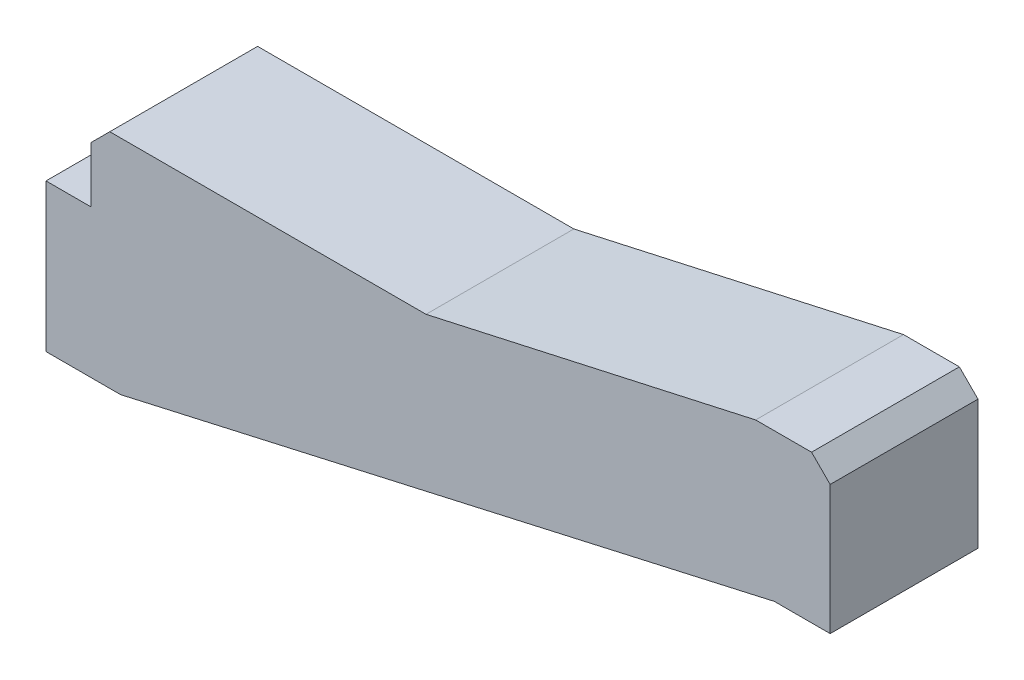
ISO-10303-21;
HEADER;
FILE_DESCRIPTION(('STEP AP214'),'2;1');
FILE_NAME('part.step','',(''),(''),'','','');
FILE_SCHEMA(('AUTOMOTIVE_DESIGN { 1 0 10303 214 1 1 1 1 }'));
ENDSEC;
DATA;
#1=APPLICATION_CONTEXT('core data for automotive mechanical design processes');
#2=APPLICATION_PROTOCOL_DEFINITION('international standard','automotive_design',2000,#1);
#3=PRODUCT_CONTEXT('',#1,'mechanical');
#4=PRODUCT('Part','Part','',(#3));
#5=PRODUCT_RELATED_PRODUCT_CATEGORY('part','',(#4));
#6=PRODUCT_DEFINITION_FORMATION('','',#4);
#7=PRODUCT_DEFINITION_CONTEXT('part definition',#1,'design');
#8=PRODUCT_DEFINITION('design','',#6,#7);
#9=PRODUCT_DEFINITION_SHAPE('','',#8);
#10=(LENGTH_UNIT() NAMED_UNIT(*) SI_UNIT(.MILLI.,.METRE.));
#11=(NAMED_UNIT(*) PLANE_ANGLE_UNIT() SI_UNIT($,.RADIAN.));
#12=(NAMED_UNIT(*) SI_UNIT($,.STERADIAN.) SOLID_ANGLE_UNIT());
#13=UNCERTAINTY_MEASURE_WITH_UNIT(LENGTH_MEASURE(1.E-05),#10,'distance_accuracy_value','');
#14=(GEOMETRIC_REPRESENTATION_CONTEXT(3) GLOBAL_UNCERTAINTY_ASSIGNED_CONTEXT((#13)) GLOBAL_UNIT_ASSIGNED_CONTEXT((#10,
#11,#12)) REPRESENTATION_CONTEXT('',''));
#15=CARTESIAN_POINT('',(0.,0.,0.));
#16=DIRECTION('',(0.,0.,1.));
#17=DIRECTION('',(1.,0.,0.));
#18=AXIS2_PLACEMENT_3D('',#15,#16,#17);
#19=CARTESIAN_POINT('',(-4.42488188976378,-0.984375000000001,1.984375));
#20=DIRECTION('',(0.217154949463908,-0.976137146062646,0.));
#21=DIRECTION('',(0.976137146062646,0.217154949463909,0.));
#22=AXIS2_PLACEMENT_3D('',#19,#20,#21);
#23=PLANE('',#22);
#24=DIRECTION('',(-0.976137146062646,-0.217154949463908,0.));
#25=VECTOR('',#24,1.);
#26=CARTESIAN_POINT('',(-4.42488188976378,-0.984375000000001,0.));
#27=LINE('',#26,#25);
#28=CARTESIAN_POINT('',(0.,0.,0.));
#29=VERTEX_POINT('',#28);
#30=CARTESIAN_POINT('',(-4.42488188976378,-0.984375000000001,0.));
#31=VERTEX_POINT('',#30);
#32=EDGE_CURVE('E137',#29,#31,#27,.T.);
#33=ORIENTED_EDGE('',*,*,#32,.T.);
#34=DIRECTION('',(0.,0.,-1.));
#35=VECTOR('',#34,1.);
#36=CARTESIAN_POINT('',(-4.42488188976378,-0.984375000000001,1.984375));
#37=LINE('',#36,#35);
#38=CARTESIAN_POINT('',(-4.42488188976378,-0.984375000000001,1.984375));
#39=VERTEX_POINT('',#38);
#40=EDGE_CURVE('E121',#39,#31,#37,.T.);
#41=ORIENTED_EDGE('',*,*,#40,.F.);
#42=DIRECTION('',(-0.976137146062646,-0.217154949463908,0.));
#43=VECTOR('',#42,1.);
#44=CARTESIAN_POINT('',(-4.42488188976378,-0.984375000000001,1.984375));
#45=LINE('',#44,#43);
#46=CARTESIAN_POINT('',(0.,0.,1.984375));
#47=VERTEX_POINT('',#46);
#48=EDGE_CURVE('E124',#47,#39,#45,.T.);
#49=ORIENTED_EDGE('',*,*,#48,.F.);
#50=DIRECTION('',(0.,0.,-1.));
#51=VECTOR('',#50,1.);
#52=CARTESIAN_POINT('',(0.,0.,1.984375));
#53=LINE('',#52,#51);
#54=EDGE_CURVE('E188',#47,#29,#53,.T.);
#55=ORIENTED_EDGE('',*,*,#54,.T.);
#56=EDGE_LOOP('',(#33,#41,#49,#55));
#57=FACE_BOUND('',#56,.T.);
#58=ADVANCED_FACE('F31',(#57),#23,.F.);
#59=CARTESIAN_POINT('',(-8.92,-0.984375000000001,1.984375));
#60=DIRECTION('',(0.,-1.,0.));
#61=DIRECTION('',(1.,0.,0.));
#62=AXIS2_PLACEMENT_3D('',#59,#60,#61);
#63=PLANE('',#62);
#64=DIRECTION('',(-1.,0.,0.));
#65=VECTOR('',#64,1.);
#66=CARTESIAN_POINT('',(-8.92,-0.984375000000001,0.));
#67=LINE('',#66,#65);
#68=CARTESIAN_POINT('',(-8.67,-0.984375000000001,0.));
#69=VERTEX_POINT('',#68);
#70=EDGE_CURVE('E170',#31,#69,#67,.T.);
#71=ORIENTED_EDGE('',*,*,#70,.T.);
#72=DIRECTION('',(0.,0.,1.));
#73=VECTOR('',#72,1.);
#74=CARTESIAN_POINT('',(-8.67,-0.984375000000001,1.984375));
#75=LINE('',#74,#73);
#76=CARTESIAN_POINT('',(-8.67,-0.984375000000001,1.984375));
#77=VERTEX_POINT('',#76);
#78=EDGE_CURVE('E11',#69,#77,#75,.T.);
#79=ORIENTED_EDGE('',*,*,#78,.T.);
#80=DIRECTION('',(-1.,0.,0.));
#81=VECTOR('',#80,1.);
#82=CARTESIAN_POINT('',(-8.92,-0.984375000000001,1.984375));
#83=LINE('',#82,#81);
#84=EDGE_CURVE('E117',#39,#77,#83,.T.);
#85=ORIENTED_EDGE('',*,*,#84,.F.);
#86=ORIENTED_EDGE('',*,*,#40,.T.);
#87=EDGE_LOOP('',(#71,#79,#85,#86));
#88=FACE_BOUND('',#87,.T.);
#89=ADVANCED_FACE('F119',(#88),#63,.F.);
#90=CARTESIAN_POINT('',(-8.92,-1.984375,1.984375));
#91=DIRECTION('',(1.,0.,0.));
#92=DIRECTION('',(0.,0.,-1.));
#93=AXIS2_PLACEMENT_3D('',#90,#91,#92);
#94=PLANE('',#93);
#95=DIRECTION('',(0.,-1.,0.));
#96=VECTOR('',#95,1.);
#97=CARTESIAN_POINT('',(-8.92,-1.984375,1.984375));
#98=LINE('',#97,#96);
#99=CARTESIAN_POINT('',(-8.92,-1.234375,1.984375));
#100=VERTEX_POINT('',#99);
#101=CARTESIAN_POINT('',(-8.92,-1.984375,1.984375));
#102=VERTEX_POINT('',#101);
#103=EDGE_CURVE('E123',#100,#102,#98,.T.);
#104=ORIENTED_EDGE('',*,*,#103,.F.);
#105=DIRECTION('',(0.,0.,-1.));
#106=VECTOR('',#105,1.);
#107=CARTESIAN_POINT('',(-8.92,-1.234375,1.984375));
#108=LINE('',#107,#106);
#109=CARTESIAN_POINT('',(-8.92,-1.234375,0.));
#110=VERTEX_POINT('',#109);
#111=EDGE_CURVE('E39',#100,#110,#108,.T.);
#112=ORIENTED_EDGE('',*,*,#111,.T.);
#113=DIRECTION('',(0.,-1.,0.));
#114=VECTOR('',#113,1.);
#115=CARTESIAN_POINT('',(-8.92,-1.984375,0.));
#116=LINE('',#115,#114);
#117=CARTESIAN_POINT('',(-8.92,-1.984375,0.));
#118=VERTEX_POINT('',#117);
#119=EDGE_CURVE('E162',#110,#118,#116,.T.);
#120=ORIENTED_EDGE('',*,*,#119,.T.);
#121=DIRECTION('',(0.,0.,-1.));
#122=VECTOR('',#121,1.);
#123=CARTESIAN_POINT('',(-8.92,-1.984375,1.984375));
#124=LINE('',#123,#122);
#125=EDGE_CURVE('E139',#102,#118,#124,.T.);
#126=ORIENTED_EDGE('',*,*,#125,.F.);
#127=EDGE_LOOP('',(#104,#112,#120,#126));
#128=FACE_BOUND('',#127,.T.);
#129=ADVANCED_FACE('F160',(#128),#94,.F.);
#130=CARTESIAN_POINT('',(-9.52612547489135,-1.984375,1.984375));
#131=DIRECTION('',(0.,-1.,0.));
#132=DIRECTION('',(0.,0.,-1.));
#133=AXIS2_PLACEMENT_3D('',#130,#131,#132);
#134=PLANE('',#133);
#135=DIRECTION('',(-1.,0.,0.));
#136=VECTOR('',#135,1.);
#137=CARTESIAN_POINT('',(-9.52612547489135,-1.984375,0.));
#138=LINE('',#137,#136);
#139=CARTESIAN_POINT('',(-9.52612547489135,-1.984375,0.));
#140=VERTEX_POINT('',#139);
#141=EDGE_CURVE('E169',#118,#140,#138,.T.);
#142=ORIENTED_EDGE('',*,*,#141,.T.);
#143=DIRECTION('',(0.,0.,-1.));
#144=VECTOR('',#143,1.);
#145=CARTESIAN_POINT('',(-9.52612547489135,-1.984375,1.984375));
#146=LINE('',#145,#144);
#147=CARTESIAN_POINT('',(-9.52612547489135,-1.984375,1.984375));
#148=VERTEX_POINT('',#147);
#149=EDGE_CURVE('E145',#148,#140,#146,.T.);
#150=ORIENTED_EDGE('',*,*,#149,.F.);
#151=DIRECTION('',(-1.,0.,0.));
#152=VECTOR('',#151,1.);
#153=CARTESIAN_POINT('',(-9.52612547489135,-1.984375,1.984375));
#154=LINE('',#153,#152);
#155=EDGE_CURVE('E357',#102,#148,#154,.T.);
#156=ORIENTED_EDGE('',*,*,#155,.F.);
#157=ORIENTED_EDGE('',*,*,#125,.T.);
#158=EDGE_LOOP('',(#142,#150,#156,#157));
#159=FACE_BOUND('',#158,.T.);
#160=ADVANCED_FACE('F257',(#159),#134,.F.);
#161=CARTESIAN_POINT('',(-9.52612547489135,-3.96875,1.984375));
#162=DIRECTION('',(1.,0.,0.));
#163=DIRECTION('',(0.,1.,0.));
#164=AXIS2_PLACEMENT_3D('',#161,#162,#163);
#165=PLANE('',#164);
#166=DIRECTION('',(0.,-1.,0.));
#167=VECTOR('',#166,1.);
#168=CARTESIAN_POINT('',(-9.52612547489135,-3.96875,0.));
#169=LINE('',#168,#167);
#170=CARTESIAN_POINT('',(-9.52612547489135,-3.96875,0.));
#171=VERTEX_POINT('',#170);
#172=EDGE_CURVE('E172',#140,#171,#169,.T.);
#173=ORIENTED_EDGE('',*,*,#172,.T.);
#174=DIRECTION('',(0.,0.,-1.));
#175=VECTOR('',#174,1.);
#176=CARTESIAN_POINT('',(-9.52612547489135,-3.96875,1.984375));
#177=LINE('',#176,#175);
#178=CARTESIAN_POINT('',(-9.52612547489135,-3.96875,1.984375));
#179=VERTEX_POINT('',#178);
#180=EDGE_CURVE('E199',#179,#171,#177,.T.);
#181=ORIENTED_EDGE('',*,*,#180,.F.);
#182=DIRECTION('',(0.,-1.,0.));
#183=VECTOR('',#182,1.);
#184=CARTESIAN_POINT('',(-9.52612547489135,-3.96875,1.984375));
#185=LINE('',#184,#183);
#186=EDGE_CURVE('E207',#148,#179,#185,.T.);
#187=ORIENTED_EDGE('',*,*,#186,.F.);
#188=ORIENTED_EDGE('',*,*,#149,.T.);
#189=EDGE_LOOP('',(#173,#181,#187,#188));
#190=FACE_BOUND('',#189,.T.);
#191=ADVANCED_FACE('F205',(#190),#165,.F.);
#192=CARTESIAN_POINT('',(-8.52612547489135,-3.96875,1.984375));
#193=DIRECTION('',(0.,1.,0.));
#194=DIRECTION('',(0.,0.,1.));
#195=AXIS2_PLACEMENT_3D('',#192,#193,#194);
#196=PLANE('',#195);
#197=DIRECTION('',(1.,0.,0.));
#198=VECTOR('',#197,1.);
#199=CARTESIAN_POINT('',(-8.52612547489135,-3.96875,0.));
#200=LINE('',#199,#198);
#201=CARTESIAN_POINT('',(-8.52612547489135,-3.96875,0.));
#202=VERTEX_POINT('',#201);
#203=EDGE_CURVE('E178',#171,#202,#200,.T.);
#204=ORIENTED_EDGE('',*,*,#203,.T.);
#205=DIRECTION('',(0.,0.,-1.));
#206=VECTOR('',#205,1.);
#207=CARTESIAN_POINT('',(-8.52612547489135,-3.96875,1.984375));
#208=LINE('',#207,#206);
#209=CARTESIAN_POINT('',(-8.52612547489135,-3.96875,1.984375));
#210=VERTEX_POINT('',#209);
#211=EDGE_CURVE('E196',#210,#202,#208,.T.);
#212=ORIENTED_EDGE('',*,*,#211,.F.);
#213=DIRECTION('',(1.,0.,0.));
#214=VECTOR('',#213,1.);
#215=CARTESIAN_POINT('',(-8.52612547489135,-3.96875,1.984375));
#216=LINE('',#215,#214);
#217=EDGE_CURVE('E224',#179,#210,#216,.T.);
#218=ORIENTED_EDGE('',*,*,#217,.F.);
#219=ORIENTED_EDGE('',*,*,#180,.T.);
#220=EDGE_LOOP('',(#204,#212,#218,#219));
#221=FACE_BOUND('',#220,.T.);
#222=ADVANCED_FACE('F215',(#221),#196,.F.);
#223=CARTESIAN_POINT('',(0.25,-1.984375,1.984375));
#224=DIRECTION('',(-0.220543129572824,0.975377223436258,0.));
#225=DIRECTION('',(-0.975377223436258,-0.220543129572824,0.));
#226=AXIS2_PLACEMENT_3D('',#223,#224,#225);
#227=PLANE('',#226);
#228=DIRECTION('',(0.975377223436258,0.220543129572824,0.));
#229=VECTOR('',#228,1.);
#230=CARTESIAN_POINT('',(0.25,-1.984375,0.));
#231=LINE('',#230,#229);
#232=CARTESIAN_POINT('',(0.25,-1.984375,0.));
#233=VERTEX_POINT('',#232);
#234=EDGE_CURVE('E180',#202,#233,#231,.T.);
#235=ORIENTED_EDGE('',*,*,#234,.T.);
#236=DIRECTION('',(0.,0.,-1.));
#237=VECTOR('',#236,1.);
#238=CARTESIAN_POINT('',(0.25,-1.984375,1.984375));
#239=LINE('',#238,#237);
#240=CARTESIAN_POINT('',(0.25,-1.984375,1.984375));
#241=VERTEX_POINT('',#240);
#242=EDGE_CURVE('E193',#241,#233,#239,.T.);
#243=ORIENTED_EDGE('',*,*,#242,.F.);
#244=DIRECTION('',(0.975377223436258,0.220543129572824,0.));
#245=VECTOR('',#244,1.);
#246=CARTESIAN_POINT('',(0.25,-1.984375,1.984375));
#247=LINE('',#246,#245);
#248=EDGE_CURVE('E221',#210,#241,#247,.T.);
#249=ORIENTED_EDGE('',*,*,#248,.F.);
#250=ORIENTED_EDGE('',*,*,#211,.T.);
#251=EDGE_LOOP('',(#235,#243,#249,#250));
#252=FACE_BOUND('',#251,.T.);
#253=ADVANCED_FACE('F219',(#252),#227,.F.);
#254=CARTESIAN_POINT('',(1.,-1.984375,1.984375));
#255=DIRECTION('',(0.,1.,0.));
#256=DIRECTION('',(0.,0.,1.));
#257=AXIS2_PLACEMENT_3D('',#254,#255,#256);
#258=PLANE('',#257);
#259=DIRECTION('',(1.,0.,0.));
#260=VECTOR('',#259,1.);
#261=CARTESIAN_POINT('',(1.,-1.984375,0.));
#262=LINE('',#261,#260);
#263=CARTESIAN_POINT('',(1.,-1.984375,0.));
#264=VERTEX_POINT('',#263);
#265=EDGE_CURVE('E182',#233,#264,#262,.T.);
#266=ORIENTED_EDGE('',*,*,#265,.T.);
#267=DIRECTION('',(0.,0.,-1.));
#268=VECTOR('',#267,1.);
#269=CARTESIAN_POINT('',(1.,-1.984375,1.984375));
#270=LINE('',#269,#268);
#271=CARTESIAN_POINT('',(1.,-1.984375,1.984375));
#272=VERTEX_POINT('',#271);
#273=EDGE_CURVE('E190',#272,#264,#270,.T.);
#274=ORIENTED_EDGE('',*,*,#273,.F.);
#275=DIRECTION('',(1.,0.,0.));
#276=VECTOR('',#275,1.);
#277=CARTESIAN_POINT('',(1.,-1.984375,1.984375));
#278=LINE('',#277,#276);
#279=EDGE_CURVE('E223',#241,#272,#278,.T.);
#280=ORIENTED_EDGE('',*,*,#279,.F.);
#281=ORIENTED_EDGE('',*,*,#242,.T.);
#282=EDGE_LOOP('',(#266,#274,#280,#281));
#283=FACE_BOUND('',#282,.T.);
#284=ADVANCED_FACE('F266',(#283),#258,.F.);
#285=CARTESIAN_POINT('',(1.,0.,1.984375));
#286=DIRECTION('',(-1.,0.,0.));
#287=DIRECTION('',(0.,-1.,0.));
#288=AXIS2_PLACEMENT_3D('',#285,#286,#287);
#289=PLANE('',#288);
#290=DIRECTION('',(0.,1.,0.));
#291=VECTOR('',#290,1.);
#292=CARTESIAN_POINT('',(1.,0.,0.));
#293=LINE('',#292,#291);
#294=CARTESIAN_POINT('',(1.,-0.25,0.));
#295=VERTEX_POINT('',#294);
#296=EDGE_CURVE('E184',#264,#295,#293,.T.);
#297=ORIENTED_EDGE('',*,*,#296,.T.);
#298=DIRECTION('',(0.,0.,1.));
#299=VECTOR('',#298,1.);
#300=CARTESIAN_POINT('',(1.,-0.25,1.984375));
#301=LINE('',#300,#299);
#302=CARTESIAN_POINT('',(1.,-0.25,1.984375));
#303=VERTEX_POINT('',#302);
#304=EDGE_CURVE('E152',#295,#303,#301,.T.);
#305=ORIENTED_EDGE('',*,*,#304,.T.);
#306=DIRECTION('',(0.,1.,0.));
#307=VECTOR('',#306,1.);
#308=CARTESIAN_POINT('',(1.,0.,1.984375));
#309=LINE('',#308,#307);
#310=EDGE_CURVE('E226',#272,#303,#309,.T.);
#311=ORIENTED_EDGE('',*,*,#310,.F.);
#312=ORIENTED_EDGE('',*,*,#273,.T.);
#313=EDGE_LOOP('',(#297,#305,#311,#312));
#314=FACE_BOUND('',#313,.T.);
#315=ADVANCED_FACE('F269',(#314),#289,.F.);
#316=CARTESIAN_POINT('',(0.,0.,1.984375));
#317=DIRECTION('',(0.,-1.,0.));
#318=DIRECTION('',(0.,0.,-1.));
#319=AXIS2_PLACEMENT_3D('',#316,#317,#318);
#320=PLANE('',#319);
#321=DIRECTION('',(-1.,0.,0.));
#322=VECTOR('',#321,1.);
#323=CARTESIAN_POINT('',(0.,0.,1.984375));
#324=LINE('',#323,#322);
#325=CARTESIAN_POINT('',(0.75,0.,1.984375));
#326=VERTEX_POINT('',#325);
#327=EDGE_CURVE('E130',#326,#47,#324,.T.);
#328=ORIENTED_EDGE('',*,*,#327,.F.);
#329=DIRECTION('',(0.,0.,-1.));
#330=VECTOR('',#329,1.);
#331=CARTESIAN_POINT('',(0.75,0.,1.984375));
#332=LINE('',#331,#330);
#333=CARTESIAN_POINT('',(0.75,0.,0.));
#334=VERTEX_POINT('',#333);
#335=EDGE_CURVE('E138',#326,#334,#332,.T.);
#336=ORIENTED_EDGE('',*,*,#335,.T.);
#337=DIRECTION('',(-1.,0.,0.));
#338=VECTOR('',#337,1.);
#339=CARTESIAN_POINT('',(0.,0.,0.));
#340=LINE('',#339,#338);
#341=EDGE_CURVE('E134',#334,#29,#340,.T.);
#342=ORIENTED_EDGE('',*,*,#341,.T.);
#343=ORIENTED_EDGE('',*,*,#54,.F.);
#344=EDGE_LOOP('',(#328,#336,#342,#343));
#345=FACE_BOUND('',#344,.T.);
#346=ADVANCED_FACE('F241',(#345),#320,.F.);
#347=CARTESIAN_POINT('',(1.,0.222463565022422,1.984375));
#348=DIRECTION('',(0.,0.,-1.));
#349=DIRECTION('',(-1.,0.,0.));
#350=AXIS2_PLACEMENT_3D('',#347,#348,#349);
#351=PLANE('',#350);
#352=ORIENTED_EDGE('',*,*,#310,.T.);
#353=DIRECTION('',(0.707106781186548,-0.707106781186548,0.));
#354=VECTOR('',#353,1.);
#355=CARTESIAN_POINT('',(0.75,0.,1.984375));
#356=LINE('',#355,#354);
#357=EDGE_CURVE('E155',#303,#326,#356,.F.);
#358=ORIENTED_EDGE('',*,*,#357,.T.);
#359=ORIENTED_EDGE('',*,*,#327,.T.);
#360=ORIENTED_EDGE('',*,*,#48,.T.);
#361=ORIENTED_EDGE('',*,*,#84,.T.);
#362=DIRECTION('',(0.707106781186545,0.70710678118655,0.));
#363=VECTOR('',#362,1.);
#364=CARTESIAN_POINT('',(-8.92,-1.234375,1.984375));
#365=LINE('',#364,#363);
#366=EDGE_CURVE('E46',#77,#100,#365,.F.);
#367=ORIENTED_EDGE('',*,*,#366,.T.);
#368=ORIENTED_EDGE('',*,*,#103,.T.);
#369=ORIENTED_EDGE('',*,*,#155,.T.);
#370=ORIENTED_EDGE('',*,*,#186,.T.);
#371=ORIENTED_EDGE('',*,*,#217,.T.);
#372=ORIENTED_EDGE('',*,*,#248,.T.);
#373=ORIENTED_EDGE('',*,*,#279,.T.);
#374=EDGE_LOOP('',(#352,#358,#359,#360,#361,#367,#368,#369,#370,#371,#372,#373));
#375=FACE_BOUND('',#374,.T.);
#376=ADVANCED_FACE('F128',(#375),#351,.F.);
#377=CARTESIAN_POINT('',(1.,0.222463565022422,0.));
#378=DIRECTION('',(0.,0.,-1.));
#379=DIRECTION('',(-1.,0.,0.));
#380=AXIS2_PLACEMENT_3D('',#377,#378,#379);
#381=PLANE('',#380);
#382=ORIENTED_EDGE('',*,*,#341,.F.);
#383=DIRECTION('',(-0.707106781186548,0.707106781186548,0.));
#384=VECTOR('',#383,1.);
#385=CARTESIAN_POINT('',(0.763768217488789,-0.0137682174887893,0.));
#386=LINE('',#385,#384);
#387=EDGE_CURVE('E150',#334,#295,#386,.F.);
#388=ORIENTED_EDGE('',*,*,#387,.T.);
#389=ORIENTED_EDGE('',*,*,#296,.F.);
#390=ORIENTED_EDGE('',*,*,#265,.F.);
#391=ORIENTED_EDGE('',*,*,#234,.F.);
#392=ORIENTED_EDGE('',*,*,#203,.F.);
#393=ORIENTED_EDGE('',*,*,#172,.F.);
#394=ORIENTED_EDGE('',*,*,#141,.F.);
#395=ORIENTED_EDGE('',*,*,#119,.F.);
#396=DIRECTION('',(-0.707106781186545,-0.70710678118655,0.));
#397=VECTOR('',#396,1.);
#398=CARTESIAN_POINT('',(-3.23158071748882,4.45404428251121,0.));
#399=LINE('',#398,#397);
#400=EDGE_CURVE('E142',#110,#69,#399,.F.);
#401=ORIENTED_EDGE('',*,*,#400,.T.);
#402=ORIENTED_EDGE('',*,*,#70,.F.);
#403=ORIENTED_EDGE('',*,*,#32,.F.);
#404=EDGE_LOOP('',(#382,#388,#389,#390,#391,#392,#393,#394,#395,#401,#402,#403));
#405=FACE_BOUND('',#404,.T.);
#406=ADVANCED_FACE('F167',(#405),#381,.T.);
#407=CARTESIAN_POINT('',(0.75,0.,1.984375));
#408=DIRECTION('',(-0.707106781186547,-0.707106781186547,0.));
#409=DIRECTION('',(0.707106781186548,-0.707106781186548,0.));
#410=AXIS2_PLACEMENT_3D('',#407,#408,#409);
#411=PLANE('',#410);
#412=ORIENTED_EDGE('',*,*,#357,.F.);
#413=ORIENTED_EDGE('',*,*,#304,.F.);
#414=ORIENTED_EDGE('',*,*,#387,.F.);
#415=ORIENTED_EDGE('',*,*,#335,.F.);
#416=EDGE_LOOP('',(#412,#413,#414,#415));
#417=FACE_BOUND('',#416,.T.);
#418=ADVANCED_FACE('F239',(#417),#411,.F.);
#419=CARTESIAN_POINT('',(-8.92,-1.234375,1.984375));
#420=DIRECTION('',(0.70710678118655,-0.707106781186545,0.));
#421=DIRECTION('',(0.707106781186545,0.70710678118655,0.));
#422=AXIS2_PLACEMENT_3D('',#419,#420,#421);
#423=PLANE('',#422);
#424=ORIENTED_EDGE('',*,*,#366,.F.);
#425=ORIENTED_EDGE('',*,*,#78,.F.);
#426=ORIENTED_EDGE('',*,*,#400,.F.);
#427=ORIENTED_EDGE('',*,*,#111,.F.);
#428=EDGE_LOOP('',(#424,#425,#426,#427));
#429=FACE_BOUND('',#428,.T.);
#430=ADVANCED_FACE('F33',(#429),#423,.F.);
#431=CLOSED_SHELL('',(#58,#89,#129,#160,#191,#222,#253,#284,#315,#346,#376,#406,#418,#430));
#432=MANIFOLD_SOLID_BREP('B2',#431);
#433=ADVANCED_BREP_SHAPE_REPRESENTATION('',(#18,#432),#14);
#434=SHAPE_DEFINITION_REPRESENTATION(#9,#433);
ENDSEC;
END-ISO-10303-21;
